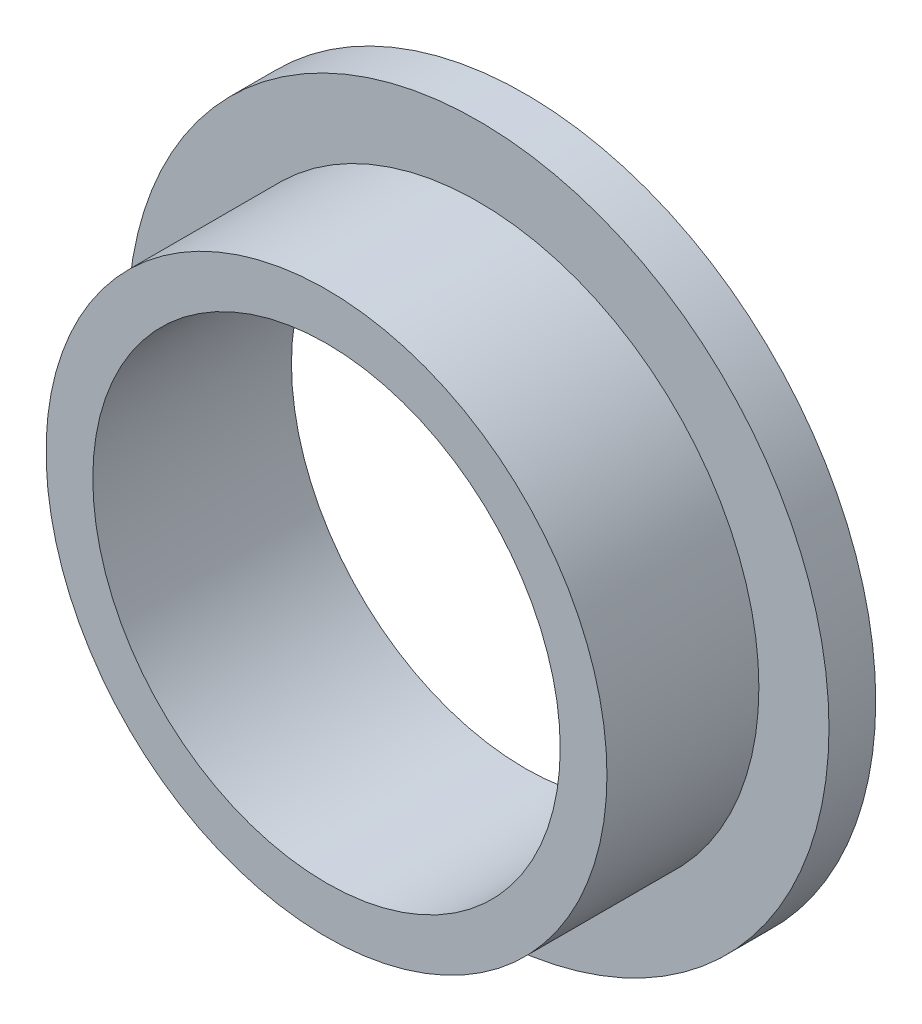
ISO-10303-21;
HEADER;
FILE_DESCRIPTION(('STEP AP214'),'2;1');
FILE_NAME('part.step','',(''),(''),'','','');
FILE_SCHEMA(('AUTOMOTIVE_DESIGN { 1 0 10303 214 1 1 1 1 }'));
ENDSEC;
DATA;
#1=APPLICATION_CONTEXT('core data for automotive mechanical design processes');
#2=APPLICATION_PROTOCOL_DEFINITION('international standard','automotive_design',2000,#1);
#3=PRODUCT_CONTEXT('',#1,'mechanical');
#4=PRODUCT('Part','Part','',(#3));
#5=PRODUCT_RELATED_PRODUCT_CATEGORY('part','',(#4));
#6=PRODUCT_DEFINITION_FORMATION('','',#4);
#7=PRODUCT_DEFINITION_CONTEXT('part definition',#1,'design');
#8=PRODUCT_DEFINITION('design','',#6,#7);
#9=PRODUCT_DEFINITION_SHAPE('','',#8);
#10=(LENGTH_UNIT() NAMED_UNIT(*) SI_UNIT(.MILLI.,.METRE.));
#11=(NAMED_UNIT(*) PLANE_ANGLE_UNIT() SI_UNIT($,.RADIAN.));
#12=(NAMED_UNIT(*) SI_UNIT($,.STERADIAN.) SOLID_ANGLE_UNIT());
#13=UNCERTAINTY_MEASURE_WITH_UNIT(LENGTH_MEASURE(1.E-05),#10,'distance_accuracy_value','');
#14=(GEOMETRIC_REPRESENTATION_CONTEXT(3) GLOBAL_UNCERTAINTY_ASSIGNED_CONTEXT((#13)) GLOBAL_UNIT_ASSIGNED_CONTEXT((#10,
#11,#12)) REPRESENTATION_CONTEXT('',''));
#15=CARTESIAN_POINT('',(0.,0.,0.));
#16=DIRECTION('',(0.,0.,1.));
#17=DIRECTION('',(1.,0.,0.));
#18=AXIS2_PLACEMENT_3D('',#15,#16,#17);
#19=CARTESIAN_POINT('',(0.,30.,0.));
#20=DIRECTION('',(0.,0.,1.));
#21=DIRECTION('',(1.,0.,0.));
#22=AXIS2_PLACEMENT_3D('',#19,#20,#21);
#23=PLANE('',#22);
#24=CARTESIAN_POINT('',(0.,0.,0.));
#25=DIRECTION('',(0.,0.,1.));
#26=DIRECTION('',(1.,0.,0.));
#27=AXIS2_PLACEMENT_3D('',#24,#25,#26);
#28=CIRCLE('',#27,45.);
#29=CARTESIAN_POINT('',(45.,0.,0.));
#30=VERTEX_POINT('',#29);
#31=EDGE_CURVE('E64',#30,#30,#28,.T.);
#32=ORIENTED_EDGE('',*,*,#31,.F.);
#33=EDGE_LOOP('',(#32));
#34=FACE_BOUND('',#33,.T.);
#35=CARTESIAN_POINT('',(0.,0.,0.));
#36=DIRECTION('',(0.,0.,1.));
#37=DIRECTION('',(1.,0.,0.));
#38=AXIS2_PLACEMENT_3D('',#35,#36,#37);
#39=CIRCLE('',#38,30.);
#40=CARTESIAN_POINT('',(30.,0.,0.));
#41=VERTEX_POINT('',#40);
#42=EDGE_CURVE('E10',#41,#41,#39,.T.);
#43=ORIENTED_EDGE('',*,*,#42,.T.);
#44=EDGE_LOOP('',(#43));
#45=FACE_BOUND('',#44,.T.);
#46=ADVANCED_FACE('F41',(#34,#45),#23,.F.);
#47=CARTESIAN_POINT('',(0.,0.,30.7627118644068));
#48=DIRECTION('',(0.,0.,1.));
#49=DIRECTION('',(1.,0.,0.));
#50=AXIS2_PLACEMENT_3D('',#47,#48,#49);
#51=CYLINDRICAL_SURFACE('',#50,30.);
#52=ORIENTED_EDGE('',*,*,#42,.F.);
#53=EDGE_LOOP('',(#52));
#54=FACE_BOUND('',#53,.T.);
#55=CARTESIAN_POINT('',(0.,0.,25.5));
#56=DIRECTION('',(0.,0.,1.));
#57=DIRECTION('',(1.,0.,0.));
#58=AXIS2_PLACEMENT_3D('',#55,#56,#57);
#59=CIRCLE('',#58,30.);
#60=CARTESIAN_POINT('',(30.,0.,25.5));
#61=VERTEX_POINT('',#60);
#62=EDGE_CURVE('E50',#61,#61,#59,.T.);
#63=ORIENTED_EDGE('',*,*,#62,.T.);
#64=EDGE_LOOP('',(#63));
#65=FACE_BOUND('',#64,.T.);
#66=ADVANCED_FACE('F68',(#54,#65),#51,.F.);
#67=CARTESIAN_POINT('',(0.,36.,25.5));
#68=DIRECTION('',(0.,0.,-1.));
#69=DIRECTION('',(-1.,0.,0.));
#70=AXIS2_PLACEMENT_3D('',#67,#68,#69);
#71=PLANE('',#70);
#72=ORIENTED_EDGE('',*,*,#62,.F.);
#73=EDGE_LOOP('',(#72));
#74=FACE_BOUND('',#73,.T.);
#75=CARTESIAN_POINT('',(0.,0.,25.5));
#76=DIRECTION('',(0.,0.,1.));
#77=DIRECTION('',(1.,0.,0.));
#78=AXIS2_PLACEMENT_3D('',#75,#76,#77);
#79=CIRCLE('',#78,36.);
#80=CARTESIAN_POINT('',(36.,0.,25.5));
#81=VERTEX_POINT('',#80);
#82=EDGE_CURVE('E51',#81,#81,#79,.T.);
#83=ORIENTED_EDGE('',*,*,#82,.T.);
#84=EDGE_LOOP('',(#83));
#85=FACE_BOUND('',#84,.T.);
#86=ADVANCED_FACE('F73',(#74,#85),#71,.F.);
#87=CARTESIAN_POINT('',(0.,0.,30.7627118644068));
#88=DIRECTION('',(0.,0.,1.));
#89=DIRECTION('',(1.,0.,0.));
#90=AXIS2_PLACEMENT_3D('',#87,#88,#89);
#91=CYLINDRICAL_SURFACE('',#90,36.);
#92=ORIENTED_EDGE('',*,*,#82,.F.);
#93=EDGE_LOOP('',(#92));
#94=FACE_BOUND('',#93,.T.);
#95=CARTESIAN_POINT('',(0.,0.,6.));
#96=DIRECTION('',(0.,0.,1.));
#97=DIRECTION('',(1.,0.,0.));
#98=AXIS2_PLACEMENT_3D('',#95,#96,#97);
#99=CIRCLE('',#98,36.);
#100=CARTESIAN_POINT('',(36.,0.,6.));
#101=VERTEX_POINT('',#100);
#102=EDGE_CURVE('E54',#101,#101,#99,.T.);
#103=ORIENTED_EDGE('',*,*,#102,.T.);
#104=EDGE_LOOP('',(#103));
#105=FACE_BOUND('',#104,.T.);
#106=ADVANCED_FACE('F80',(#94,#105),#91,.T.);
#107=CARTESIAN_POINT('',(0.,36.,6.));
#108=DIRECTION('',(0.,0.,-1.));
#109=DIRECTION('',(-1.,0.,0.));
#110=AXIS2_PLACEMENT_3D('',#107,#108,#109);
#111=PLANE('',#110);
#112=ORIENTED_EDGE('',*,*,#102,.F.);
#113=EDGE_LOOP('',(#112));
#114=FACE_BOUND('',#113,.T.);
#115=CARTESIAN_POINT('',(0.,0.,6.));
#116=DIRECTION('',(0.,0.,1.));
#117=DIRECTION('',(1.,0.,0.));
#118=AXIS2_PLACEMENT_3D('',#115,#116,#117);
#119=CIRCLE('',#118,45.);
#120=CARTESIAN_POINT('',(45.,0.,6.));
#121=VERTEX_POINT('',#120);
#122=EDGE_CURVE('E58',#121,#121,#119,.T.);
#123=ORIENTED_EDGE('',*,*,#122,.T.);
#124=EDGE_LOOP('',(#123));
#125=FACE_BOUND('',#124,.T.);
#126=ADVANCED_FACE('F82',(#114,#125),#111,.F.);
#127=CARTESIAN_POINT('',(0.,0.,30.7627118644068));
#128=DIRECTION('',(0.,0.,1.));
#129=DIRECTION('',(1.,0.,0.));
#130=AXIS2_PLACEMENT_3D('',#127,#128,#129);
#131=CYLINDRICAL_SURFACE('',#130,45.);
#132=ORIENTED_EDGE('',*,*,#122,.F.);
#133=EDGE_LOOP('',(#132));
#134=FACE_BOUND('',#133,.T.);
#135=ORIENTED_EDGE('',*,*,#31,.T.);
#136=EDGE_LOOP('',(#135));
#137=FACE_BOUND('',#136,.T.);
#138=ADVANCED_FACE('F70',(#134,#137),#131,.T.);
#139=CLOSED_SHELL('',(#46,#66,#86,#106,#126,#138));
#140=MANIFOLD_SOLID_BREP('B2',#139);
#141=ADVANCED_BREP_SHAPE_REPRESENTATION('',(#18,#140),#14);
#142=SHAPE_DEFINITION_REPRESENTATION(#9,#141);
ENDSEC;
END-ISO-10303-21;
